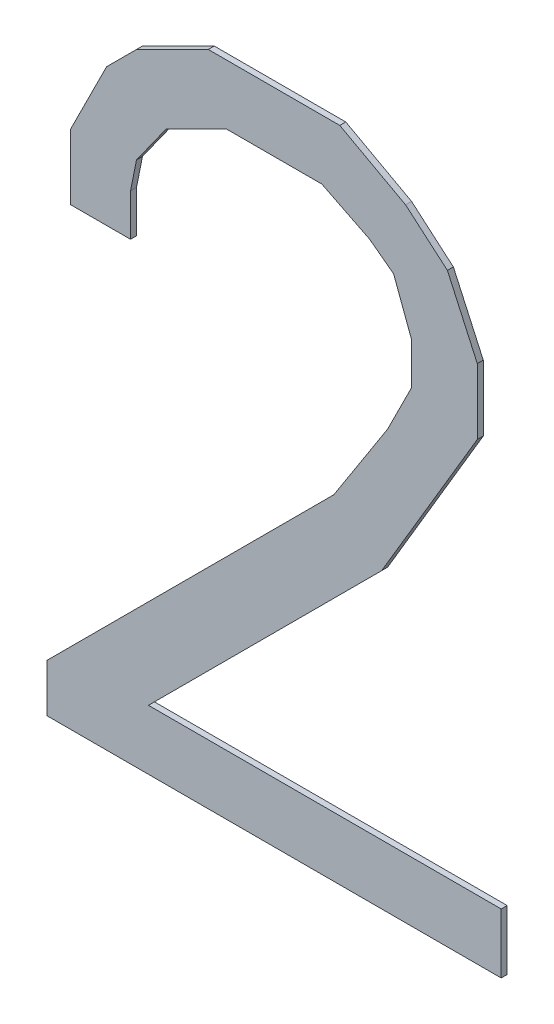
ISO-10303-21;
HEADER;
FILE_DESCRIPTION(('STEP AP214'),'2;1');
FILE_NAME('part.step','',(''),(''),'','','');
FILE_SCHEMA(('AUTOMOTIVE_DESIGN { 1 0 10303 214 1 1 1 1 }'));
ENDSEC;
DATA;
#1=APPLICATION_CONTEXT('core data for automotive mechanical design processes');
#2=APPLICATION_PROTOCOL_DEFINITION('international standard','automotive_design',2000,#1);
#3=PRODUCT_CONTEXT('',#1,'mechanical');
#4=PRODUCT('Part','Part','',(#3));
#5=PRODUCT_RELATED_PRODUCT_CATEGORY('part','',(#4));
#6=PRODUCT_DEFINITION_FORMATION('','',#4);
#7=PRODUCT_DEFINITION_CONTEXT('part definition',#1,'design');
#8=PRODUCT_DEFINITION('design','',#6,#7);
#9=PRODUCT_DEFINITION_SHAPE('','',#8);
#10=(LENGTH_UNIT() NAMED_UNIT(*) SI_UNIT(.MILLI.,.METRE.));
#11=(NAMED_UNIT(*) PLANE_ANGLE_UNIT() SI_UNIT($,.RADIAN.));
#12=(NAMED_UNIT(*) SI_UNIT($,.STERADIAN.) SOLID_ANGLE_UNIT());
#13=UNCERTAINTY_MEASURE_WITH_UNIT(LENGTH_MEASURE(1.E-05),#10,'distance_accuracy_value','');
#14=(GEOMETRIC_REPRESENTATION_CONTEXT(3) GLOBAL_UNCERTAINTY_ASSIGNED_CONTEXT((#13)) GLOBAL_UNIT_ASSIGNED_CONTEXT((#10,
#11,#12)) REPRESENTATION_CONTEXT('',''));
#15=CARTESIAN_POINT('',(0.,0.,0.));
#16=DIRECTION('',(0.,0.,1.));
#17=DIRECTION('',(1.,0.,0.));
#18=AXIS2_PLACEMENT_3D('',#15,#16,#17);
#19=CARTESIAN_POINT('',(-0.33999932,0.21000212,0.01));
#20=DIRECTION('',(0.,0.,1.));
#21=DIRECTION('',(1.,0.,0.));
#22=AXIS2_PLACEMENT_3D('',#19,#20,#21);
#23=PLANE('',#22);
#24=DIRECTION('',(-0.447213595499958,-0.894427190999916,0.));
#25=VECTOR('',#24,1.);
#26=CARTESIAN_POINT('',(-0.33999932,0.3200019,0.01));
#27=LINE('',#26,#25);
#28=CARTESIAN_POINT('',(-0.33999932,0.3200019,0.01));
#29=VERTEX_POINT('',#28);
#30=CARTESIAN_POINT('',(-0.27999944,0.44000166,0.01));
#31=VERTEX_POINT('',#30);
#32=EDGE_CURVE('E317',#29,#31,#27,.F.);
#33=ORIENTED_EDGE('',*,*,#32,.F.);
#34=DIRECTION('',(0.,1.,0.));
#35=VECTOR('',#34,1.);
#36=CARTESIAN_POINT('',(-0.33999932,0.21000212,0.01));
#37=LINE('',#36,#35);
#38=CARTESIAN_POINT('',(-0.33999932,0.21000212,0.01));
#39=VERTEX_POINT('',#38);
#40=EDGE_CURVE('E214',#39,#29,#37,.T.);
#41=ORIENTED_EDGE('',*,*,#40,.F.);
#42=DIRECTION('',(1.,0.,0.));
#43=VECTOR('',#42,1.);
#44=CARTESIAN_POINT('',(-0.23999952,0.21000212,0.01));
#45=LINE('',#44,#43);
#46=CARTESIAN_POINT('',(-0.23999952,0.21000212,0.01));
#47=VERTEX_POINT('',#46);
#48=EDGE_CURVE('E20',#47,#39,#45,.F.);
#49=ORIENTED_EDGE('',*,*,#48,.F.);
#50=DIRECTION('',(0.,1.,0.));
#51=VECTOR('',#50,1.);
#52=CARTESIAN_POINT('',(-0.23999952,0.28000198,0.01));
#53=LINE('',#52,#51);
#54=CARTESIAN_POINT('',(-0.239999519999998,0.280001979999999,0.01));
#55=VERTEX_POINT('',#54);
#56=EDGE_CURVE('E203',#55,#47,#53,.F.);
#57=ORIENTED_EDGE('',*,*,#56,.F.);
#58=DIRECTION('',(0.196116135137992,0.980580675690959,0.));
#59=VECTOR('',#58,1.);
#60=CARTESIAN_POINT('',(-0.22999954,0.33000188,0.01));
#61=LINE('',#60,#59);
#62=CARTESIAN_POINT('',(-0.229999539999996,0.330001879999997,0.01));
#63=VERTEX_POINT('',#62);
#64=EDGE_CURVE('E198',#63,#55,#61,.F.);
#65=ORIENTED_EDGE('',*,*,#64,.F.);
#66=DIRECTION('',(0.581238193718907,0.81373347120687,0.));
#67=VECTOR('',#66,1.);
#68=CARTESIAN_POINT('',(-0.17999964,0.40000174,0.01));
#69=LINE('',#68,#67);
#70=CARTESIAN_POINT('',(-0.17999964,0.40000174,0.01));
#71=VERTEX_POINT('',#70);
#72=EDGE_CURVE('E225',#71,#63,#69,.F.);
#73=ORIENTED_EDGE('',*,*,#72,.F.);
#74=DIRECTION('',(0.894427190999916,0.447213595499958,0.));
#75=VECTOR('',#74,1.);
#76=CARTESIAN_POINT('',(-0.07999984,0.45000164,0.01));
#77=LINE('',#76,#75);
#78=CARTESIAN_POINT('',(-0.07999984,0.45000164,0.01));
#79=VERTEX_POINT('',#78);
#80=EDGE_CURVE('E229',#79,#71,#77,.F.);
#81=ORIENTED_EDGE('',*,*,#80,.F.);
#82=DIRECTION('',(1.,0.,0.));
#83=VECTOR('',#82,1.);
#84=CARTESIAN_POINT('',(0.07999984,0.45000164,0.01));
#85=LINE('',#84,#83);
#86=CARTESIAN_POINT('',(0.0799998400000003,0.45000164,0.01));
#87=VERTEX_POINT('',#86);
#88=EDGE_CURVE('E233',#87,#79,#85,.F.);
#89=ORIENTED_EDGE('',*,*,#88,.F.);
#90=DIRECTION('',(0.894427190999916,-0.447213595499958,0.));
#91=VECTOR('',#90,1.);
#92=CARTESIAN_POINT('',(0.15999968,0.41000172,0.01));
#93=LINE('',#92,#91);
#94=CARTESIAN_POINT('',(0.15999968,0.41000172,0.01));
#95=VERTEX_POINT('',#94);
#96=EDGE_CURVE('E237',#95,#87,#93,.F.);
#97=ORIENTED_EDGE('',*,*,#96,.F.);
#98=DIRECTION('',(0.8,-0.6,0.));
#99=VECTOR('',#98,1.);
#100=CARTESIAN_POINT('',(0.1999996,0.38000178,0.01));
#101=LINE('',#100,#99);
#102=CARTESIAN_POINT('',(0.199999599999988,0.380001779999996,0.01));
#103=VERTEX_POINT('',#102);
#104=EDGE_CURVE('E241',#103,#95,#101,.F.);
#105=ORIENTED_EDGE('',*,*,#104,.F.);
#106=DIRECTION('',(0.35112344158894,-0.936329177568839,0.));
#107=VECTOR('',#106,1.);
#108=CARTESIAN_POINT('',(0.22999954,0.30000194,0.01));
#109=LINE('',#108,#107);
#110=CARTESIAN_POINT('',(0.22999954,0.30000194,0.01));
#111=VERTEX_POINT('',#110);
#112=EDGE_CURVE('E245',#111,#103,#109,.F.);
#113=ORIENTED_EDGE('',*,*,#112,.F.);
#114=DIRECTION('',(0.,1.,0.));
#115=VECTOR('',#114,1.);
#116=CARTESIAN_POINT('',(0.22999954,0.23000208,0.01));
#117=LINE('',#116,#115);
#118=CARTESIAN_POINT('',(0.229999539999989,0.230002080000005,0.01));
#119=VERTEX_POINT('',#118);
#120=EDGE_CURVE('E249',#119,#111,#117,.T.);
#121=ORIENTED_EDGE('',*,*,#120,.F.);
#122=DIRECTION('',(-0.447202236503894,-0.894432870407788,0.));
#123=VECTOR('',#122,1.);
#124=CARTESIAN_POINT('',(0.18999962,0.1499997,0.01));
#125=LINE('',#124,#123);
#126=CARTESIAN_POINT('',(0.189999620000021,0.149999699999986,0.01));
#127=VERTEX_POINT('',#126);
#128=EDGE_CURVE('E253',#127,#119,#125,.F.);
#129=ORIENTED_EDGE('',*,*,#128,.F.);
#130=DIRECTION('',(-0.540757591314105,-0.841178475376164,0.));
#131=VECTOR('',#130,1.);
#132=CARTESIAN_POINT('',(0.09999979999998,0.009999980000003,0.01));
#133=LINE('',#132,#131);
#134=CARTESIAN_POINT('',(0.0999997999999832,0.00999998000000061,0.01));
#135=VERTEX_POINT('',#134);
#136=EDGE_CURVE('E257',#135,#127,#133,.F.);
#137=ORIENTED_EDGE('',*,*,#136,.F.);
#138=DIRECTION('',(-0.707106781186548,-0.707106781186548,0.));
#139=VECTOR('',#138,1.);
#140=CARTESIAN_POINT('',(-0.37999924,-0.46999906,0.01));
#141=LINE('',#140,#139);
#142=CARTESIAN_POINT('',(-0.37999924,-0.46999906,0.01));
#143=VERTEX_POINT('',#142);
#144=EDGE_CURVE('E261',#143,#135,#141,.F.);
#145=ORIENTED_EDGE('',*,*,#144,.F.);
#146=DIRECTION('',(0.,1.,0.));
#147=VECTOR('',#146,1.);
#148=CARTESIAN_POINT('',(-0.37999924,-0.5499989,0.01));
#149=LINE('',#148,#147);
#150=CARTESIAN_POINT('',(-0.37999924,-0.5499989,0.01));
#151=VERTEX_POINT('',#150);
#152=EDGE_CURVE('E265',#151,#143,#149,.T.);
#153=ORIENTED_EDGE('',*,*,#152,.F.);
#154=DIRECTION('',(1.,0.,0.));
#155=VECTOR('',#154,1.);
#156=CARTESIAN_POINT('',(0.37999924,-0.5499989,0.01));
#157=LINE('',#156,#155);
#158=CARTESIAN_POINT('',(0.37999924,-0.5499989,0.01));
#159=VERTEX_POINT('',#158);
#160=EDGE_CURVE('E269',#159,#151,#157,.F.);
#161=ORIENTED_EDGE('',*,*,#160,.F.);
#162=DIRECTION('',(0.,1.,0.));
#163=VECTOR('',#162,1.);
#164=CARTESIAN_POINT('',(0.37999924,-0.4499991,0.01));
#165=LINE('',#164,#163);
#166=CARTESIAN_POINT('',(0.37999924,-0.4499991,0.01));
#167=VERTEX_POINT('',#166);
#168=EDGE_CURVE('E273',#167,#159,#165,.F.);
#169=ORIENTED_EDGE('',*,*,#168,.F.);
#170=DIRECTION('',(1.,0.,0.));
#171=VECTOR('',#170,1.);
#172=CARTESIAN_POINT('',(-0.20999958,-0.4499991,0.01));
#173=LINE('',#172,#171);
#174=CARTESIAN_POINT('',(-0.209999580000001,-0.449999099999999,0.01));
#175=VERTEX_POINT('',#174);
#176=EDGE_CURVE('E277',#175,#167,#173,.T.);
#177=ORIENTED_EDGE('',*,*,#176,.F.);
#178=DIRECTION('',(0.707106781186548,0.707106781186548,0.));
#179=VECTOR('',#178,1.);
#180=CARTESIAN_POINT('',(0.17999964,-0.05999987999999,0.01));
#181=LINE('',#180,#179);
#182=CARTESIAN_POINT('',(0.179999640000009,-0.0599998799999939,0.01));
#183=VERTEX_POINT('',#182);
#184=EDGE_CURVE('E281',#183,#175,#181,.F.);
#185=ORIENTED_EDGE('',*,*,#184,.F.);
#186=DIRECTION('',(0.509798840848119,0.8602936370042,0.));
#187=VECTOR('',#186,1.);
#188=CARTESIAN_POINT('',(0.33999932,0.21000212,0.01));
#189=LINE('',#188,#187);
#190=CARTESIAN_POINT('',(0.33999932,0.21000212,0.01));
#191=VERTEX_POINT('',#190);
#192=EDGE_CURVE('E285',#191,#183,#189,.F.);
#193=ORIENTED_EDGE('',*,*,#192,.F.);
#194=DIRECTION('',(0.,1.,0.));
#195=VECTOR('',#194,1.);
#196=CARTESIAN_POINT('',(0.33999932,0.3200019,0.01));
#197=LINE('',#196,#195);
#198=CARTESIAN_POINT('',(0.339999319999991,0.320001899999996,0.01));
#199=VERTEX_POINT('',#198);
#200=EDGE_CURVE('E289',#199,#191,#197,.F.);
#201=ORIENTED_EDGE('',*,*,#200,.F.);
#202=DIRECTION('',(-0.413802944300883,0.910366477462742,0.));
#203=VECTOR('',#202,1.);
#204=CARTESIAN_POINT('',(0.28999942,0.43000168,0.01));
#205=LINE('',#204,#203);
#206=CARTESIAN_POINT('',(0.289999419999997,0.430001679999996,0.01));
#207=VERTEX_POINT('',#206);
#208=EDGE_CURVE('E293',#207,#199,#205,.F.);
#209=ORIENTED_EDGE('',*,*,#208,.F.);
#210=DIRECTION('',(-0.759256602365155,0.650791373456133,0.));
#211=VECTOR('',#210,1.);
#212=CARTESIAN_POINT('',(0.21999956,0.49000156,0.01));
#213=LINE('',#212,#211);
#214=CARTESIAN_POINT('',(0.219999559999992,0.490001559999985,0.01));
#215=VERTEX_POINT('',#214);
#216=EDGE_CURVE('E297',#215,#207,#213,.F.);
#217=ORIENTED_EDGE('',*,*,#216,.F.);
#218=DIRECTION('',(-0.877895572914117,0.478852130681064,0.));
#219=VECTOR('',#218,1.);
#220=CARTESIAN_POINT('',(0.10999978,0.55000144,0.01));
#221=LINE('',#220,#219);
#222=CARTESIAN_POINT('',(0.10999978,0.55000144,0.01));
#223=VERTEX_POINT('',#222);
#224=EDGE_CURVE('E301',#223,#215,#221,.F.);
#225=ORIENTED_EDGE('',*,*,#224,.F.);
#226=DIRECTION('',(1.,0.,0.));
#227=VECTOR('',#226,1.);
#228=CARTESIAN_POINT('',(-0.10999978,0.55000144,0.01));
#229=LINE('',#228,#227);
#230=CARTESIAN_POINT('',(-0.10999978,0.55000144,0.01));
#231=VERTEX_POINT('',#230);
#232=EDGE_CURVE('E305',#231,#223,#229,.T.);
#233=ORIENTED_EDGE('',*,*,#232,.F.);
#234=DIRECTION('',(-0.894427190999916,-0.447213595499958,0.));
#235=VECTOR('',#234,1.);
#236=CARTESIAN_POINT('',(-0.22999954,0.49000156,0.01));
#237=LINE('',#236,#235);
#238=CARTESIAN_POINT('',(-0.22999954,0.49000156,0.01));
#239=VERTEX_POINT('',#238);
#240=EDGE_CURVE('E309',#239,#231,#237,.F.);
#241=ORIENTED_EDGE('',*,*,#240,.F.);
#242=DIRECTION('',(-0.707106781186548,-0.707106781186548,0.));
#243=VECTOR('',#242,1.);
#244=CARTESIAN_POINT('',(-0.27999944,0.44000166,0.01));
#245=LINE('',#244,#243);
#246=EDGE_CURVE('E313',#31,#239,#245,.F.);
#247=ORIENTED_EDGE('',*,*,#246,.F.);
#248=EDGE_LOOP('',(#33,#41,#49,#57,#65,#73,#81,#89,#97,#105,#113,#121,#129,#137,#145,#153,#161,
#169,#177,#185,#193,#201,#209,#217,#225,#233,#241,#247));
#249=FACE_BOUND('',#248,.T.);
#250=ADVANCED_FACE('F17',(#249),#23,.T.);
#251=CARTESIAN_POINT('',(-0.23999952,0.21000212,0.));
#252=DIRECTION('',(0.,-1.,0.));
#253=DIRECTION('',(0.,0.,-1.));
#254=AXIS2_PLACEMENT_3D('',#251,#252,#253);
#255=PLANE('',#254);
#256=DIRECTION('',(0.,0.,1.));
#257=VECTOR('',#256,1.);
#258=CARTESIAN_POINT('',(-0.33999932,0.21000212,0.));
#259=LINE('',#258,#257);
#260=CARTESIAN_POINT('',(-0.33999932,0.21000212,0.));
#261=VERTEX_POINT('',#260);
#262=EDGE_CURVE('E321',#261,#39,#259,.T.);
#263=ORIENTED_EDGE('',*,*,#262,.F.);
#264=DIRECTION('',(1.,0.,0.));
#265=VECTOR('',#264,1.);
#266=CARTESIAN_POINT('',(-0.33999932,0.21000212,0.));
#267=LINE('',#266,#265);
#268=CARTESIAN_POINT('',(-0.23999952,0.21000212,0.));
#269=VERTEX_POINT('',#268);
#270=EDGE_CURVE('E220',#261,#269,#267,.T.);
#271=ORIENTED_EDGE('',*,*,#270,.T.);
#272=DIRECTION('',(0.,0.,-1.));
#273=VECTOR('',#272,1.);
#274=CARTESIAN_POINT('',(-0.23999952,0.21000212,0.));
#275=LINE('',#274,#273);
#276=EDGE_CURVE('E208',#47,#269,#275,.T.);
#277=ORIENTED_EDGE('',*,*,#276,.F.);
#278=ORIENTED_EDGE('',*,*,#48,.T.);
#279=EDGE_LOOP('',(#263,#271,#277,#278));
#280=FACE_BOUND('',#279,.T.);
#281=ADVANCED_FACE('F219',(#280),#255,.T.);
#282=CARTESIAN_POINT('',(-0.23999952,0.28000198,0.));
#283=DIRECTION('',(1.,0.,0.));
#284=DIRECTION('',(0.,0.,-1.));
#285=AXIS2_PLACEMENT_3D('',#282,#283,#284);
#286=PLANE('',#285);
#287=ORIENTED_EDGE('',*,*,#276,.T.);
#288=DIRECTION('',(0.,1.,0.));
#289=VECTOR('',#288,1.);
#290=CARTESIAN_POINT('',(-0.23999952,0.21000212,0.));
#291=LINE('',#290,#289);
#292=CARTESIAN_POINT('',(-0.239999519999998,0.280001979999999,0.));
#293=VERTEX_POINT('',#292);
#294=EDGE_CURVE('E326',#269,#293,#291,.T.);
#295=ORIENTED_EDGE('',*,*,#294,.T.);
#296=DIRECTION('',(0.,0.,1.));
#297=VECTOR('',#296,1.);
#298=CARTESIAN_POINT('',(-0.23999951999999,0.280001979999998,0.));
#299=LINE('',#298,#297);
#300=EDGE_CURVE('E210',#55,#293,#299,.F.);
#301=ORIENTED_EDGE('',*,*,#300,.F.);
#302=ORIENTED_EDGE('',*,*,#56,.T.);
#303=EDGE_LOOP('',(#287,#295,#301,#302));
#304=FACE_BOUND('',#303,.T.);
#305=ADVANCED_FACE('F205',(#304),#286,.T.);
#306=CARTESIAN_POINT('',(-0.22999954,0.33000188,0.));
#307=DIRECTION('',(0.980580675690959,-0.196116135137992,0.));
#308=DIRECTION('',(0.196116135137992,0.980580675690959,0.));
#309=AXIS2_PLACEMENT_3D('',#306,#307,#308);
#310=PLANE('',#309);
#311=ORIENTED_EDGE('',*,*,#300,.T.);
#312=DIRECTION('',(0.196116135138184,0.98058067569092,0.));
#313=VECTOR('',#312,1.);
#314=CARTESIAN_POINT('',(-0.23999952,0.28000198,0.));
#315=LINE('',#314,#313);
#316=CARTESIAN_POINT('',(-0.229999539999996,0.330001879999997,0.));
#317=VERTEX_POINT('',#316);
#318=EDGE_CURVE('E328',#293,#317,#315,.T.);
#319=ORIENTED_EDGE('',*,*,#318,.T.);
#320=DIRECTION('',(0.,0.,1.));
#321=VECTOR('',#320,1.);
#322=CARTESIAN_POINT('',(-0.229999539999984,0.330001879999988,0.));
#323=LINE('',#322,#321);
#324=EDGE_CURVE('E227',#63,#317,#323,.F.);
#325=ORIENTED_EDGE('',*,*,#324,.F.);
#326=ORIENTED_EDGE('',*,*,#64,.T.);
#327=EDGE_LOOP('',(#311,#319,#325,#326));
#328=FACE_BOUND('',#327,.T.);
#329=ADVANCED_FACE('F522',(#328),#310,.T.);
#330=CARTESIAN_POINT('',(-0.17999964,0.40000174,0.));
#331=DIRECTION('',(0.81373347120687,-0.581238193718907,0.));
#332=DIRECTION('',(0.581238193718907,0.81373347120687,0.));
#333=AXIS2_PLACEMENT_3D('',#330,#331,#332);
#334=PLANE('',#333);
#335=ORIENTED_EDGE('',*,*,#324,.T.);
#336=DIRECTION('',(0.581238193719097,0.813733471206735,0.));
#337=VECTOR('',#336,1.);
#338=CARTESIAN_POINT('',(-0.22999954,0.33000188,0.));
#339=LINE('',#338,#337);
#340=CARTESIAN_POINT('',(-0.17999964,0.40000174,0.));
#341=VERTEX_POINT('',#340);
#342=EDGE_CURVE('E331',#317,#341,#339,.T.);
#343=ORIENTED_EDGE('',*,*,#342,.T.);
#344=DIRECTION('',(0.,0.,1.));
#345=VECTOR('',#344,1.);
#346=CARTESIAN_POINT('',(-0.17999964,0.40000174,0.));
#347=LINE('',#346,#345);
#348=EDGE_CURVE('E231',#71,#341,#347,.F.);
#349=ORIENTED_EDGE('',*,*,#348,.F.);
#350=ORIENTED_EDGE('',*,*,#72,.T.);
#351=EDGE_LOOP('',(#335,#343,#349,#350));
#352=FACE_BOUND('',#351,.T.);
#353=ADVANCED_FACE('F521',(#352),#334,.T.);
#354=CARTESIAN_POINT('',(-0.07999984,0.45000164,0.));
#355=DIRECTION('',(0.447213595499958,-0.894427190999916,0.));
#356=DIRECTION('',(0.894427190999916,0.447213595499958,0.));
#357=AXIS2_PLACEMENT_3D('',#354,#355,#356);
#358=PLANE('',#357);
#359=ORIENTED_EDGE('',*,*,#348,.T.);
#360=DIRECTION('',(0.894427190999916,0.447213595499958,0.));
#361=VECTOR('',#360,1.);
#362=CARTESIAN_POINT('',(-0.17999964,0.40000174,0.));
#363=LINE('',#362,#361);
#364=CARTESIAN_POINT('',(-0.07999984,0.45000164,0.));
#365=VERTEX_POINT('',#364);
#366=EDGE_CURVE('E334',#341,#365,#363,.T.);
#367=ORIENTED_EDGE('',*,*,#366,.T.);
#368=DIRECTION('',(0.,0.,-1.));
#369=VECTOR('',#368,1.);
#370=CARTESIAN_POINT('',(-0.07999984,0.45000164,0.));
#371=LINE('',#370,#369);
#372=EDGE_CURVE('E235',#79,#365,#371,.T.);
#373=ORIENTED_EDGE('',*,*,#372,.F.);
#374=ORIENTED_EDGE('',*,*,#80,.T.);
#375=EDGE_LOOP('',(#359,#367,#373,#374));
#376=FACE_BOUND('',#375,.T.);
#377=ADVANCED_FACE('F515',(#376),#358,.T.);
#378=CARTESIAN_POINT('',(0.07999984,0.45000164,0.));
#379=DIRECTION('',(0.,-1.,0.));
#380=DIRECTION('',(0.,0.,-1.));
#381=AXIS2_PLACEMENT_3D('',#378,#379,#380);
#382=PLANE('',#381);
#383=ORIENTED_EDGE('',*,*,#372,.T.);
#384=DIRECTION('',(1.,0.,0.));
#385=VECTOR('',#384,1.);
#386=CARTESIAN_POINT('',(-0.33999932,0.45000164,0.));
#387=LINE('',#386,#385);
#388=CARTESIAN_POINT('',(0.0799998400000002,0.45000164,0.));
#389=VERTEX_POINT('',#388);
#390=EDGE_CURVE('E337',#365,#389,#387,.T.);
#391=ORIENTED_EDGE('',*,*,#390,.T.);
#392=DIRECTION('',(0.,0.,1.));
#393=VECTOR('',#392,1.);
#394=CARTESIAN_POINT('',(0.07999984,0.45000164,0.));
#395=LINE('',#394,#393);
#396=EDGE_CURVE('E239',#87,#389,#395,.F.);
#397=ORIENTED_EDGE('',*,*,#396,.F.);
#398=ORIENTED_EDGE('',*,*,#88,.T.);
#399=EDGE_LOOP('',(#383,#391,#397,#398));
#400=FACE_BOUND('',#399,.T.);
#401=ADVANCED_FACE('F511',(#400),#382,.T.);
#402=CARTESIAN_POINT('',(0.15999968,0.41000172,0.));
#403=DIRECTION('',(-0.447213595499958,-0.894427190999916,0.));
#404=DIRECTION('',(0.894427190999916,-0.447213595499958,0.));
#405=AXIS2_PLACEMENT_3D('',#402,#403,#404);
#406=PLANE('',#405);
#407=ORIENTED_EDGE('',*,*,#396,.T.);
#408=DIRECTION('',(0.894427190999916,-0.447213595499958,0.));
#409=VECTOR('',#408,1.);
#410=CARTESIAN_POINT('',(0.07999984,0.45000164,0.));
#411=LINE('',#410,#409);
#412=CARTESIAN_POINT('',(0.15999968,0.41000172,0.));
#413=VERTEX_POINT('',#412);
#414=EDGE_CURVE('E340',#389,#413,#411,.T.);
#415=ORIENTED_EDGE('',*,*,#414,.T.);
#416=DIRECTION('',(0.,0.,1.));
#417=VECTOR('',#416,1.);
#418=CARTESIAN_POINT('',(0.15999968,0.41000172,0.));
#419=LINE('',#418,#417);
#420=EDGE_CURVE('E243',#95,#413,#419,.F.);
#421=ORIENTED_EDGE('',*,*,#420,.F.);
#422=ORIENTED_EDGE('',*,*,#96,.T.);
#423=EDGE_LOOP('',(#407,#415,#421,#422));
#424=FACE_BOUND('',#423,.T.);
#425=ADVANCED_FACE('F505',(#424),#406,.T.);
#426=CARTESIAN_POINT('',(0.1999996,0.38000178,0.));
#427=DIRECTION('',(-0.6,-0.8,0.));
#428=DIRECTION('',(0.8,-0.6,0.));
#429=AXIS2_PLACEMENT_3D('',#426,#427,#428);
#430=PLANE('',#429);
#431=ORIENTED_EDGE('',*,*,#420,.T.);
#432=DIRECTION('',(0.8,-0.6,0.));
#433=VECTOR('',#432,1.);
#434=CARTESIAN_POINT('',(0.15999968,0.41000172,0.));
#435=LINE('',#434,#433);
#436=CARTESIAN_POINT('',(0.199999599999988,0.380001779999996,0.));
#437=VERTEX_POINT('',#436);
#438=EDGE_CURVE('E343',#413,#437,#435,.T.);
#439=ORIENTED_EDGE('',*,*,#438,.T.);
#440=DIRECTION('',(0.,0.,1.));
#441=VECTOR('',#440,1.);
#442=CARTESIAN_POINT('',(0.199999599999953,0.380001779999983,0.));
#443=LINE('',#442,#441);
#444=EDGE_CURVE('E247',#103,#437,#443,.F.);
#445=ORIENTED_EDGE('',*,*,#444,.F.);
#446=ORIENTED_EDGE('',*,*,#104,.T.);
#447=EDGE_LOOP('',(#431,#439,#445,#446));
#448=FACE_BOUND('',#447,.T.);
#449=ADVANCED_FACE('F501',(#448),#430,.T.);
#450=CARTESIAN_POINT('',(0.22999954,0.30000194,0.));
#451=DIRECTION('',(-0.936329177568839,-0.35112344158894,0.));
#452=DIRECTION('',(0.35112344158894,-0.936329177568839,0.));
#453=AXIS2_PLACEMENT_3D('',#450,#451,#452);
#454=PLANE('',#453);
#455=ORIENTED_EDGE('',*,*,#444,.T.);
#456=DIRECTION('',(0.351123441588392,-0.936329177569045,0.));
#457=VECTOR('',#456,1.);
#458=CARTESIAN_POINT('',(0.1999996,0.38000178,0.));
#459=LINE('',#458,#457);
#460=CARTESIAN_POINT('',(0.22999954,0.30000194,0.));
#461=VERTEX_POINT('',#460);
#462=EDGE_CURVE('E346',#437,#461,#459,.T.);
#463=ORIENTED_EDGE('',*,*,#462,.T.);
#464=DIRECTION('',(0.,0.,1.));
#465=VECTOR('',#464,1.);
#466=CARTESIAN_POINT('',(0.22999954,0.30000194,0.));
#467=LINE('',#466,#465);
#468=EDGE_CURVE('E251',#111,#461,#467,.F.);
#469=ORIENTED_EDGE('',*,*,#468,.F.);
#470=ORIENTED_EDGE('',*,*,#112,.T.);
#471=EDGE_LOOP('',(#455,#463,#469,#470));
#472=FACE_BOUND('',#471,.T.);
#473=ADVANCED_FACE('F495',(#472),#454,.T.);
#474=CARTESIAN_POINT('',(0.22999954,0.23000208,0.));
#475=DIRECTION('',(-1.,0.,0.));
#476=DIRECTION('',(0.,0.,1.));
#477=AXIS2_PLACEMENT_3D('',#474,#475,#476);
#478=PLANE('',#477);
#479=ORIENTED_EDGE('',*,*,#468,.T.);
#480=DIRECTION('',(0.,1.,0.));
#481=VECTOR('',#480,1.);
#482=CARTESIAN_POINT('',(0.22999954,0.21000212,0.));
#483=LINE('',#482,#481);
#484=CARTESIAN_POINT('',(0.229999539999989,0.230002080000005,0.));
#485=VERTEX_POINT('',#484);
#486=EDGE_CURVE('E349',#461,#485,#483,.F.);
#487=ORIENTED_EDGE('',*,*,#486,.T.);
#488=DIRECTION('',(0.,0.,1.));
#489=VECTOR('',#488,1.);
#490=CARTESIAN_POINT('',(0.229999539999958,0.230002080000021,0.));
#491=LINE('',#490,#489);
#492=EDGE_CURVE('E255',#119,#485,#491,.F.);
#493=ORIENTED_EDGE('',*,*,#492,.F.);
#494=ORIENTED_EDGE('',*,*,#120,.T.);
#495=EDGE_LOOP('',(#479,#487,#493,#494));
#496=FACE_BOUND('',#495,.T.);
#497=ADVANCED_FACE('F491',(#496),#478,.T.);
#498=CARTESIAN_POINT('',(0.18999962,0.1499997,0.));
#499=DIRECTION('',(-0.894432870407788,0.447202236503894,0.));
#500=DIRECTION('',(-0.447202236503894,-0.894432870407788,0.));
#501=AXIS2_PLACEMENT_3D('',#498,#499,#500);
#502=PLANE('',#501);
#503=ORIENTED_EDGE('',*,*,#492,.T.);
#504=DIRECTION('',(-0.447202236504369,-0.894432870407551,0.));
#505=VECTOR('',#504,1.);
#506=CARTESIAN_POINT('',(0.22999954,0.23000208,0.));
#507=LINE('',#506,#505);
#508=CARTESIAN_POINT('',(0.189999620000021,0.149999699999986,0.));
#509=VERTEX_POINT('',#508);
#510=EDGE_CURVE('E352',#485,#509,#507,.T.);
#511=ORIENTED_EDGE('',*,*,#510,.T.);
#512=DIRECTION('',(0.,0.,1.));
#513=VECTOR('',#512,1.);
#514=CARTESIAN_POINT('',(0.189999620000085,0.149999699999945,0.));
#515=LINE('',#514,#513);
#516=EDGE_CURVE('E259',#127,#509,#515,.F.);
#517=ORIENTED_EDGE('',*,*,#516,.F.);
#518=ORIENTED_EDGE('',*,*,#128,.T.);
#519=EDGE_LOOP('',(#503,#511,#517,#518));
#520=FACE_BOUND('',#519,.T.);
#521=ADVANCED_FACE('F485',(#520),#502,.T.);
#522=CARTESIAN_POINT('',(0.09999979999998,0.009999980000003,0.));
#523=DIRECTION('',(-0.841178475376164,0.540757591314105,0.));
#524=DIRECTION('',(-0.540757591314105,-0.841178475376164,0.));
#525=AXIS2_PLACEMENT_3D('',#522,#523,#524);
#526=PLANE('',#525);
#527=ORIENTED_EDGE('',*,*,#516,.T.);
#528=DIRECTION('',(-0.540757591313592,-0.841178475376493,0.));
#529=VECTOR('',#528,1.);
#530=CARTESIAN_POINT('',(0.18999962,0.1499997,0.));
#531=LINE('',#530,#529);
#532=CARTESIAN_POINT('',(0.0999997999999831,0.00999998000000039,0.));
#533=VERTEX_POINT('',#532);
#534=EDGE_CURVE('E355',#509,#533,#531,.T.);
#535=ORIENTED_EDGE('',*,*,#534,.T.);
#536=DIRECTION('',(0.,0.,1.));
#537=VECTOR('',#536,1.);
#538=CARTESIAN_POINT('',(0.0999997999999916,0.00999997999999154,0.));
#539=LINE('',#538,#537);
#540=EDGE_CURVE('E263',#135,#533,#539,.F.);
#541=ORIENTED_EDGE('',*,*,#540,.F.);
#542=ORIENTED_EDGE('',*,*,#136,.T.);
#543=EDGE_LOOP('',(#527,#535,#541,#542));
#544=FACE_BOUND('',#543,.T.);
#545=ADVANCED_FACE('F481',(#544),#526,.T.);
#546=CARTESIAN_POINT('',(-0.37999924,-0.46999906,0.));
#547=DIRECTION('',(-0.707106781186548,0.707106781186548,0.));
#548=DIRECTION('',(-0.707106781186548,-0.707106781186548,0.));
#549=AXIS2_PLACEMENT_3D('',#546,#547,#548);
#550=PLANE('',#549);
#551=ORIENTED_EDGE('',*,*,#540,.T.);
#552=DIRECTION('',(-0.70710678118653,-0.707106781186565,0.));
#553=VECTOR('',#552,1.);
#554=CARTESIAN_POINT('',(0.09999979999998,0.00999998000000301,0.));
#555=LINE('',#554,#553);
#556=CARTESIAN_POINT('',(-0.37999924,-0.46999906,0.));
#557=VERTEX_POINT('',#556);
#558=EDGE_CURVE('E358',#533,#557,#555,.T.);
#559=ORIENTED_EDGE('',*,*,#558,.T.);
#560=DIRECTION('',(0.,0.,1.));
#561=VECTOR('',#560,1.);
#562=CARTESIAN_POINT('',(-0.37999924,-0.46999906,0.));
#563=LINE('',#562,#561);
#564=EDGE_CURVE('E267',#143,#557,#563,.F.);
#565=ORIENTED_EDGE('',*,*,#564,.F.);
#566=ORIENTED_EDGE('',*,*,#144,.T.);
#567=EDGE_LOOP('',(#551,#559,#565,#566));
#568=FACE_BOUND('',#567,.T.);
#569=ADVANCED_FACE('F475',(#568),#550,.T.);
#570=CARTESIAN_POINT('',(-0.37999924,-0.5499989,0.));
#571=DIRECTION('',(-1.,0.,0.));
#572=DIRECTION('',(0.,0.,1.));
#573=AXIS2_PLACEMENT_3D('',#570,#571,#572);
#574=PLANE('',#573);
#575=ORIENTED_EDGE('',*,*,#564,.T.);
#576=DIRECTION('',(0.,1.,0.));
#577=VECTOR('',#576,1.);
#578=CARTESIAN_POINT('',(-0.37999924,0.21000212,0.));
#579=LINE('',#578,#577);
#580=CARTESIAN_POINT('',(-0.37999924,-0.5499989,0.));
#581=VERTEX_POINT('',#580);
#582=EDGE_CURVE('E361',#557,#581,#579,.F.);
#583=ORIENTED_EDGE('',*,*,#582,.T.);
#584=DIRECTION('',(0.,0.,-1.));
#585=VECTOR('',#584,1.);
#586=CARTESIAN_POINT('',(-0.37999924,-0.5499989,0.));
#587=LINE('',#586,#585);
#588=EDGE_CURVE('E271',#151,#581,#587,.T.);
#589=ORIENTED_EDGE('',*,*,#588,.F.);
#590=ORIENTED_EDGE('',*,*,#152,.T.);
#591=EDGE_LOOP('',(#575,#583,#589,#590));
#592=FACE_BOUND('',#591,.T.);
#593=ADVANCED_FACE('F471',(#592),#574,.T.);
#594=CARTESIAN_POINT('',(0.37999924,-0.5499989,0.));
#595=DIRECTION('',(0.,-1.,0.));
#596=DIRECTION('',(0.,0.,-1.));
#597=AXIS2_PLACEMENT_3D('',#594,#595,#596);
#598=PLANE('',#597);
#599=ORIENTED_EDGE('',*,*,#588,.T.);
#600=DIRECTION('',(1.,0.,0.));
#601=VECTOR('',#600,1.);
#602=CARTESIAN_POINT('',(-0.33999932,-0.5499989,0.));
#603=LINE('',#602,#601);
#604=CARTESIAN_POINT('',(0.37999924,-0.5499989,0.));
#605=VERTEX_POINT('',#604);
#606=EDGE_CURVE('E364',#581,#605,#603,.T.);
#607=ORIENTED_EDGE('',*,*,#606,.T.);
#608=DIRECTION('',(0.,0.,-1.));
#609=VECTOR('',#608,1.);
#610=CARTESIAN_POINT('',(0.37999924,-0.5499989,0.));
#611=LINE('',#610,#609);
#612=EDGE_CURVE('E275',#159,#605,#611,.T.);
#613=ORIENTED_EDGE('',*,*,#612,.F.);
#614=ORIENTED_EDGE('',*,*,#160,.T.);
#615=EDGE_LOOP('',(#599,#607,#613,#614));
#616=FACE_BOUND('',#615,.T.);
#617=ADVANCED_FACE('F465',(#616),#598,.T.);
#618=CARTESIAN_POINT('',(0.37999924,-0.4499991,0.));
#619=DIRECTION('',(1.,0.,0.));
#620=DIRECTION('',(0.,0.,-1.));
#621=AXIS2_PLACEMENT_3D('',#618,#619,#620);
#622=PLANE('',#621);
#623=ORIENTED_EDGE('',*,*,#612,.T.);
#624=DIRECTION('',(0.,1.,0.));
#625=VECTOR('',#624,1.);
#626=CARTESIAN_POINT('',(0.37999924,0.21000212,0.));
#627=LINE('',#626,#625);
#628=CARTESIAN_POINT('',(0.37999924,-0.4499991,0.));
#629=VERTEX_POINT('',#628);
#630=EDGE_CURVE('E367',#605,#629,#627,.T.);
#631=ORIENTED_EDGE('',*,*,#630,.T.);
#632=DIRECTION('',(0.,0.,1.));
#633=VECTOR('',#632,1.);
#634=CARTESIAN_POINT('',(0.37999924,-0.4499991,0.));
#635=LINE('',#634,#633);
#636=EDGE_CURVE('E279',#167,#629,#635,.F.);
#637=ORIENTED_EDGE('',*,*,#636,.F.);
#638=ORIENTED_EDGE('',*,*,#168,.T.);
#639=EDGE_LOOP('',(#623,#631,#637,#638));
#640=FACE_BOUND('',#639,.T.);
#641=ADVANCED_FACE('F461',(#640),#622,.T.);
#642=CARTESIAN_POINT('',(-0.20999958,-0.4499991,0.));
#643=DIRECTION('',(0.,1.,0.));
#644=DIRECTION('',(0.,0.,1.));
#645=AXIS2_PLACEMENT_3D('',#642,#643,#644);
#646=PLANE('',#645);
#647=ORIENTED_EDGE('',*,*,#636,.T.);
#648=DIRECTION('',(1.,0.,0.));
#649=VECTOR('',#648,1.);
#650=CARTESIAN_POINT('',(-0.33999932,-0.4499991,0.));
#651=LINE('',#650,#649);
#652=CARTESIAN_POINT('',(-0.209999580000001,-0.449999099999999,0.));
#653=VERTEX_POINT('',#652);
#654=EDGE_CURVE('E370',#629,#653,#651,.F.);
#655=ORIENTED_EDGE('',*,*,#654,.T.);
#656=DIRECTION('',(0.,0.,1.));
#657=VECTOR('',#656,1.);
#658=CARTESIAN_POINT('',(-0.209999580000005,-0.449999099999995,0.));
#659=LINE('',#658,#657);
#660=EDGE_CURVE('E283',#175,#653,#659,.F.);
#661=ORIENTED_EDGE('',*,*,#660,.F.);
#662=ORIENTED_EDGE('',*,*,#176,.T.);
#663=EDGE_LOOP('',(#647,#655,#661,#662));
#664=FACE_BOUND('',#663,.T.);
#665=ADVANCED_FACE('F455',(#664),#646,.T.);
#666=CARTESIAN_POINT('',(0.17999964,-0.05999987999999,0.));
#667=DIRECTION('',(0.707106781186548,-0.707106781186548,0.));
#668=DIRECTION('',(0.707106781186548,0.707106781186548,0.));
#669=AXIS2_PLACEMENT_3D('',#666,#667,#668);
#670=PLANE('',#669);
#671=ORIENTED_EDGE('',*,*,#660,.T.);
#672=DIRECTION('',(0.707106781186538,0.707106781186556,0.));
#673=VECTOR('',#672,1.);
#674=CARTESIAN_POINT('',(-0.20999958,-0.4499991,0.));
#675=LINE('',#674,#673);
#676=CARTESIAN_POINT('',(0.179999640000009,-0.0599998799999945,0.));
#677=VERTEX_POINT('',#676);
#678=EDGE_CURVE('E373',#653,#677,#675,.T.);
#679=ORIENTED_EDGE('',*,*,#678,.T.);
#680=DIRECTION('',(0.,0.,1.));
#681=VECTOR('',#680,1.);
#682=CARTESIAN_POINT('',(0.179999640000034,-0.0599998800000102,0.));
#683=LINE('',#682,#681);
#684=EDGE_CURVE('E287',#183,#677,#683,.F.);
#685=ORIENTED_EDGE('',*,*,#684,.F.);
#686=ORIENTED_EDGE('',*,*,#184,.T.);
#687=EDGE_LOOP('',(#671,#679,#685,#686));
#688=FACE_BOUND('',#687,.T.);
#689=ADVANCED_FACE('F451',(#688),#670,.T.);
#690=CARTESIAN_POINT('',(0.33999932,0.21000212,0.));
#691=DIRECTION('',(0.8602936370042,-0.509798840848119,0.));
#692=DIRECTION('',(0.509798840848119,0.8602936370042,0.));
#693=AXIS2_PLACEMENT_3D('',#690,#691,#692);
#694=PLANE('',#693);
#695=ORIENTED_EDGE('',*,*,#684,.T.);
#696=DIRECTION('',(0.509798840848227,0.860293637004136,0.));
#697=VECTOR('',#696,1.);
#698=CARTESIAN_POINT('',(0.17999964,-0.05999987999999,0.));
#699=LINE('',#698,#697);
#700=CARTESIAN_POINT('',(0.33999932,0.21000212,0.));
#701=VERTEX_POINT('',#700);
#702=EDGE_CURVE('E376',#677,#701,#699,.T.);
#703=ORIENTED_EDGE('',*,*,#702,.T.);
#704=DIRECTION('',(0.,0.,-1.));
#705=VECTOR('',#704,1.);
#706=CARTESIAN_POINT('',(0.33999932,0.21000212,0.));
#707=LINE('',#706,#705);
#708=EDGE_CURVE('E291',#191,#701,#707,.T.);
#709=ORIENTED_EDGE('',*,*,#708,.F.);
#710=ORIENTED_EDGE('',*,*,#192,.T.);
#711=EDGE_LOOP('',(#695,#703,#709,#710));
#712=FACE_BOUND('',#711,.T.);
#713=ADVANCED_FACE('F445',(#712),#694,.T.);
#714=CARTESIAN_POINT('',(0.33999932,0.3200019,0.));
#715=DIRECTION('',(1.,0.,0.));
#716=DIRECTION('',(0.,0.,-1.));
#717=AXIS2_PLACEMENT_3D('',#714,#715,#716);
#718=PLANE('',#717);
#719=ORIENTED_EDGE('',*,*,#708,.T.);
#720=DIRECTION('',(0.,1.,0.));
#721=VECTOR('',#720,1.);
#722=CARTESIAN_POINT('',(0.33999932,0.21000212,0.));
#723=LINE('',#722,#721);
#724=CARTESIAN_POINT('',(0.339999319999991,0.320001899999996,0.));
#725=VERTEX_POINT('',#724);
#726=EDGE_CURVE('E379',#701,#725,#723,.T.);
#727=ORIENTED_EDGE('',*,*,#726,.T.);
#728=DIRECTION('',(0.,0.,1.));
#729=VECTOR('',#728,1.);
#730=CARTESIAN_POINT('',(0.339999319999964,0.320001899999983,0.));
#731=LINE('',#730,#729);
#732=EDGE_CURVE('E295',#199,#725,#731,.F.);
#733=ORIENTED_EDGE('',*,*,#732,.F.);
#734=ORIENTED_EDGE('',*,*,#200,.T.);
#735=EDGE_LOOP('',(#719,#727,#733,#734));
#736=FACE_BOUND('',#735,.T.);
#737=ADVANCED_FACE('F441',(#736),#718,.T.);
#738=CARTESIAN_POINT('',(0.28999942,0.43000168,0.));
#739=DIRECTION('',(0.910366477462742,0.413802944300883,0.));
#740=DIRECTION('',(-0.413802944300883,0.910366477462742,0.));
#741=AXIS2_PLACEMENT_3D('',#738,#739,#740);
#742=PLANE('',#741);
#743=ORIENTED_EDGE('',*,*,#732,.T.);
#744=DIRECTION('',(-0.413802944301184,0.910366477462605,0.));
#745=VECTOR('',#744,1.);
#746=CARTESIAN_POINT('',(0.33999932,0.3200019,0.));
#747=LINE('',#746,#745);
#748=CARTESIAN_POINT('',(0.289999419999997,0.430001679999996,0.));
#749=VERTEX_POINT('',#748);
#750=EDGE_CURVE('E382',#725,#749,#747,.T.);
#751=ORIENTED_EDGE('',*,*,#750,.T.);
#752=DIRECTION('',(0.,0.,1.));
#753=VECTOR('',#752,1.);
#754=CARTESIAN_POINT('',(0.289999419999987,0.430001679999985,0.));
#755=LINE('',#754,#753);
#756=EDGE_CURVE('E299',#207,#749,#755,.F.);
#757=ORIENTED_EDGE('',*,*,#756,.F.);
#758=ORIENTED_EDGE('',*,*,#208,.T.);
#759=EDGE_LOOP('',(#743,#751,#757,#758));
#760=FACE_BOUND('',#759,.T.);
#761=ADVANCED_FACE('F435',(#760),#742,.T.);
#762=CARTESIAN_POINT('',(0.21999956,0.49000156,0.));
#763=DIRECTION('',(0.650791373456133,0.759256602365155,0.));
#764=DIRECTION('',(-0.759256602365155,0.650791373456133,0.));
#765=AXIS2_PLACEMENT_3D('',#762,#763,#764);
#766=PLANE('',#765);
#767=ORIENTED_EDGE('',*,*,#756,.T.);
#768=DIRECTION('',(-0.759256602365296,0.650791373455969,0.));
#769=VECTOR('',#768,1.);
#770=CARTESIAN_POINT('',(0.28999942,0.43000168,0.));
#771=LINE('',#770,#769);
#772=CARTESIAN_POINT('',(0.219999559999992,0.490001559999985,0.));
#773=VERTEX_POINT('',#772);
#774=EDGE_CURVE('E385',#749,#773,#771,.T.);
#775=ORIENTED_EDGE('',*,*,#774,.T.);
#776=DIRECTION('',(0.,0.,1.));
#777=VECTOR('',#776,1.);
#778=CARTESIAN_POINT('',(0.219999559999966,0.490001559999938,0.));
#779=LINE('',#778,#777);
#780=EDGE_CURVE('E303',#215,#773,#779,.F.);
#781=ORIENTED_EDGE('',*,*,#780,.F.);
#782=ORIENTED_EDGE('',*,*,#216,.T.);
#783=EDGE_LOOP('',(#767,#775,#781,#782));
#784=FACE_BOUND('',#783,.T.);
#785=ADVANCED_FACE('F431',(#784),#766,.T.);
#786=CARTESIAN_POINT('',(0.10999978,0.55000144,0.));
#787=DIRECTION('',(0.478852130681064,0.877895572914117,0.));
#788=DIRECTION('',(-0.877895572914117,0.478852130681064,0.));
#789=AXIS2_PLACEMENT_3D('',#786,#787,#788);
#790=PLANE('',#789);
#791=ORIENTED_EDGE('',*,*,#780,.T.);
#792=DIRECTION('',(-0.877895572914385,0.478852130680573,0.));
#793=VECTOR('',#792,1.);
#794=CARTESIAN_POINT('',(0.21999956,0.49000156,0.));
#795=LINE('',#794,#793);
#796=CARTESIAN_POINT('',(0.10999978,0.55000144,0.));
#797=VERTEX_POINT('',#796);
#798=EDGE_CURVE('E388',#773,#797,#795,.T.);
#799=ORIENTED_EDGE('',*,*,#798,.T.);
#800=DIRECTION('',(0.,0.,1.));
#801=VECTOR('',#800,1.);
#802=CARTESIAN_POINT('',(0.10999978,0.55000144,0.));
#803=LINE('',#802,#801);
#804=EDGE_CURVE('E307',#223,#797,#803,.F.);
#805=ORIENTED_EDGE('',*,*,#804,.F.);
#806=ORIENTED_EDGE('',*,*,#224,.T.);
#807=EDGE_LOOP('',(#791,#799,#805,#806));
#808=FACE_BOUND('',#807,.T.);
#809=ADVANCED_FACE('F425',(#808),#790,.T.);
#810=CARTESIAN_POINT('',(-0.10999978,0.55000144,0.));
#811=DIRECTION('',(0.,1.,0.));
#812=DIRECTION('',(0.,0.,1.));
#813=AXIS2_PLACEMENT_3D('',#810,#811,#812);
#814=PLANE('',#813);
#815=ORIENTED_EDGE('',*,*,#804,.T.);
#816=DIRECTION('',(1.,0.,0.));
#817=VECTOR('',#816,1.);
#818=CARTESIAN_POINT('',(-0.33999932,0.55000144,0.));
#819=LINE('',#818,#817);
#820=CARTESIAN_POINT('',(-0.10999978,0.55000144,0.));
#821=VERTEX_POINT('',#820);
#822=EDGE_CURVE('E391',#797,#821,#819,.F.);
#823=ORIENTED_EDGE('',*,*,#822,.T.);
#824=DIRECTION('',(0.,0.,1.));
#825=VECTOR('',#824,1.);
#826=CARTESIAN_POINT('',(-0.10999978,0.55000144,0.));
#827=LINE('',#826,#825);
#828=EDGE_CURVE('E311',#231,#821,#827,.F.);
#829=ORIENTED_EDGE('',*,*,#828,.F.);
#830=ORIENTED_EDGE('',*,*,#232,.T.);
#831=EDGE_LOOP('',(#815,#823,#829,#830));
#832=FACE_BOUND('',#831,.T.);
#833=ADVANCED_FACE('F421',(#832),#814,.T.);
#834=CARTESIAN_POINT('',(-0.22999954,0.49000156,0.));
#835=DIRECTION('',(-0.447213595499958,0.894427190999916,0.));
#836=DIRECTION('',(-0.894427190999916,-0.447213595499958,0.));
#837=AXIS2_PLACEMENT_3D('',#834,#835,#836);
#838=PLANE('',#837);
#839=ORIENTED_EDGE('',*,*,#828,.T.);
#840=DIRECTION('',(-0.894427190999916,-0.447213595499957,0.));
#841=VECTOR('',#840,1.);
#842=CARTESIAN_POINT('',(-0.10999978,0.55000144,0.));
#843=LINE('',#842,#841);
#844=CARTESIAN_POINT('',(-0.22999954,0.49000156,0.));
#845=VERTEX_POINT('',#844);
#846=EDGE_CURVE('E394',#821,#845,#843,.T.);
#847=ORIENTED_EDGE('',*,*,#846,.T.);
#848=DIRECTION('',(0.,0.,1.));
#849=VECTOR('',#848,1.);
#850=CARTESIAN_POINT('',(-0.22999954,0.49000156,0.));
#851=LINE('',#850,#849);
#852=EDGE_CURVE('E315',#239,#845,#851,.F.);
#853=ORIENTED_EDGE('',*,*,#852,.F.);
#854=ORIENTED_EDGE('',*,*,#240,.T.);
#855=EDGE_LOOP('',(#839,#847,#853,#854));
#856=FACE_BOUND('',#855,.T.);
#857=ADVANCED_FACE('F415',(#856),#838,.T.);
#858=CARTESIAN_POINT('',(-0.27999944,0.44000166,0.));
#859=DIRECTION('',(-0.707106781186548,0.707106781186548,0.));
#860=DIRECTION('',(-0.707106781186548,-0.707106781186548,0.));
#861=AXIS2_PLACEMENT_3D('',#858,#859,#860);
#862=PLANE('',#861);
#863=ORIENTED_EDGE('',*,*,#852,.T.);
#864=DIRECTION('',(-0.707106781186548,-0.707106781186548,0.));
#865=VECTOR('',#864,1.);
#866=CARTESIAN_POINT('',(-0.22999954,0.49000156,0.));
#867=LINE('',#866,#865);
#868=CARTESIAN_POINT('',(-0.27999944,0.44000166,0.));
#869=VERTEX_POINT('',#868);
#870=EDGE_CURVE('E397',#845,#869,#867,.T.);
#871=ORIENTED_EDGE('',*,*,#870,.T.);
#872=DIRECTION('',(0.,0.,1.));
#873=VECTOR('',#872,1.);
#874=CARTESIAN_POINT('',(-0.27999944,0.44000166,0.));
#875=LINE('',#874,#873);
#876=EDGE_CURVE('E319',#31,#869,#875,.F.);
#877=ORIENTED_EDGE('',*,*,#876,.F.);
#878=ORIENTED_EDGE('',*,*,#246,.T.);
#879=EDGE_LOOP('',(#863,#871,#877,#878));
#880=FACE_BOUND('',#879,.T.);
#881=ADVANCED_FACE('F410',(#880),#862,.T.);
#882=CARTESIAN_POINT('',(-0.33999932,0.3200019,0.));
#883=DIRECTION('',(-0.894427190999916,0.447213595499958,0.));
#884=DIRECTION('',(-0.447213595499958,-0.894427190999916,0.));
#885=AXIS2_PLACEMENT_3D('',#882,#883,#884);
#886=PLANE('',#885);
#887=ORIENTED_EDGE('',*,*,#876,.T.);
#888=DIRECTION('',(-0.447213595499958,-0.894427190999916,0.));
#889=VECTOR('',#888,1.);
#890=CARTESIAN_POINT('',(-0.27999944,0.44000166,0.));
#891=LINE('',#890,#889);
#892=CARTESIAN_POINT('',(-0.33999932,0.3200019,0.));
#893=VERTEX_POINT('',#892);
#894=EDGE_CURVE('E26',#869,#893,#891,.T.);
#895=ORIENTED_EDGE('',*,*,#894,.T.);
#896=DIRECTION('',(0.,0.,1.));
#897=VECTOR('',#896,1.);
#898=CARTESIAN_POINT('',(-0.33999932,0.3200019,0.));
#899=LINE('',#898,#897);
#900=EDGE_CURVE('E34',#29,#893,#899,.F.);
#901=ORIENTED_EDGE('',*,*,#900,.F.);
#902=ORIENTED_EDGE('',*,*,#32,.T.);
#903=EDGE_LOOP('',(#887,#895,#901,#902));
#904=FACE_BOUND('',#903,.T.);
#905=ADVANCED_FACE('F403',(#904),#886,.T.);
#906=CARTESIAN_POINT('',(-0.33999932,0.21000212,0.));
#907=DIRECTION('',(-1.,0.,0.));
#908=DIRECTION('',(0.,0.,1.));
#909=AXIS2_PLACEMENT_3D('',#906,#907,#908);
#910=PLANE('',#909);
#911=ORIENTED_EDGE('',*,*,#900,.T.);
#912=DIRECTION('',(0.,1.,0.));
#913=VECTOR('',#912,1.);
#914=CARTESIAN_POINT('',(-0.33999932,0.21000212,0.));
#915=LINE('',#914,#913);
#916=EDGE_CURVE('E11',#893,#261,#915,.F.);
#917=ORIENTED_EDGE('',*,*,#916,.T.);
#918=ORIENTED_EDGE('',*,*,#262,.T.);
#919=ORIENTED_EDGE('',*,*,#40,.T.);
#920=EDGE_LOOP('',(#911,#917,#918,#919));
#921=FACE_BOUND('',#920,.T.);
#922=ADVANCED_FACE('F523',(#921),#910,.T.);
#923=CARTESIAN_POINT('',(-0.33999932,0.21000212,0.));
#924=DIRECTION('',(0.,0.,1.));
#925=DIRECTION('',(1.,0.,0.));
#926=AXIS2_PLACEMENT_3D('',#923,#924,#925);
#927=PLANE('',#926);
#928=ORIENTED_EDGE('',*,*,#894,.F.);
#929=ORIENTED_EDGE('',*,*,#870,.F.);
#930=ORIENTED_EDGE('',*,*,#846,.F.);
#931=ORIENTED_EDGE('',*,*,#822,.F.);
#932=ORIENTED_EDGE('',*,*,#798,.F.);
#933=ORIENTED_EDGE('',*,*,#774,.F.);
#934=ORIENTED_EDGE('',*,*,#750,.F.);
#935=ORIENTED_EDGE('',*,*,#726,.F.);
#936=ORIENTED_EDGE('',*,*,#702,.F.);
#937=ORIENTED_EDGE('',*,*,#678,.F.);
#938=ORIENTED_EDGE('',*,*,#654,.F.);
#939=ORIENTED_EDGE('',*,*,#630,.F.);
#940=ORIENTED_EDGE('',*,*,#606,.F.);
#941=ORIENTED_EDGE('',*,*,#582,.F.);
#942=ORIENTED_EDGE('',*,*,#558,.F.);
#943=ORIENTED_EDGE('',*,*,#534,.F.);
#944=ORIENTED_EDGE('',*,*,#510,.F.);
#945=ORIENTED_EDGE('',*,*,#486,.F.);
#946=ORIENTED_EDGE('',*,*,#462,.F.);
#947=ORIENTED_EDGE('',*,*,#438,.F.);
#948=ORIENTED_EDGE('',*,*,#414,.F.);
#949=ORIENTED_EDGE('',*,*,#390,.F.);
#950=ORIENTED_EDGE('',*,*,#366,.F.);
#951=ORIENTED_EDGE('',*,*,#342,.F.);
#952=ORIENTED_EDGE('',*,*,#318,.F.);
#953=ORIENTED_EDGE('',*,*,#294,.F.);
#954=ORIENTED_EDGE('',*,*,#270,.F.);
#955=ORIENTED_EDGE('',*,*,#916,.F.);
#956=EDGE_LOOP('',(#928,#929,#930,#931,#932,#933,#934,#935,#936,#937,#938,#939,#940,#941,#942,
#943,#944,#945,#946,#947,#948,#949,#950,#951,#952,#953,#954,#955));
#957=FACE_BOUND('',#956,.T.);
#958=ADVANCED_FACE('F407',(#957),#927,.F.);
#959=CLOSED_SHELL('',(#250,#281,#305,#329,#353,#377,#401,#425,#449,#473,#497,#521,#545,#569,
#593,#617,#641,#665,#689,#713,#737,#761,#785,#809,#833,#857,#881,#905,#922,#958));
#960=MANIFOLD_SOLID_BREP('B1',#959);
#961=ADVANCED_BREP_SHAPE_REPRESENTATION('',(#18,#960),#14);
#962=SHAPE_DEFINITION_REPRESENTATION(#9,#961);
ENDSEC;
END-ISO-10303-21;
